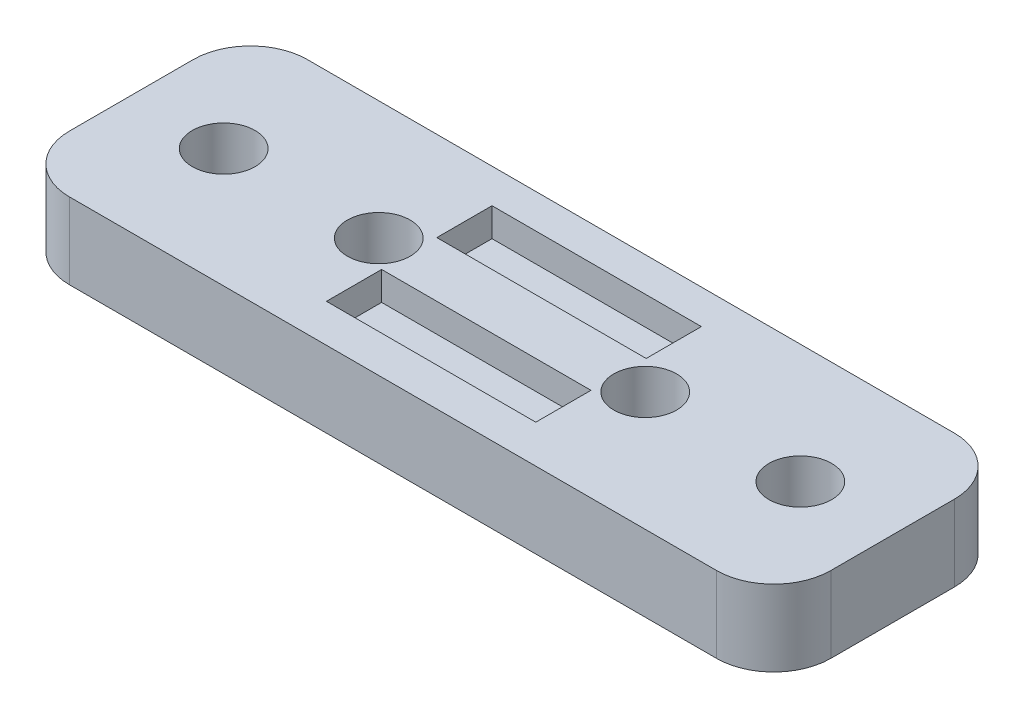
ISO-10303-21;
HEADER;
FILE_DESCRIPTION(('STEP AP214'),'2;1');
FILE_NAME('part.step','',(''),(''),'','','');
FILE_SCHEMA(('AUTOMOTIVE_DESIGN { 1 0 10303 214 1 1 1 1 }'));
ENDSEC;
DATA;
#1=APPLICATION_CONTEXT('core data for automotive mechanical design processes');
#2=APPLICATION_PROTOCOL_DEFINITION('international standard','automotive_design',2000,#1);
#3=PRODUCT_CONTEXT('',#1,'mechanical');
#4=PRODUCT('Part','Part','',(#3));
#5=PRODUCT_RELATED_PRODUCT_CATEGORY('part','',(#4));
#6=PRODUCT_DEFINITION_FORMATION('','',#4);
#7=PRODUCT_DEFINITION_CONTEXT('part definition',#1,'design');
#8=PRODUCT_DEFINITION('design','',#6,#7);
#9=PRODUCT_DEFINITION_SHAPE('','',#8);
#10=(LENGTH_UNIT() NAMED_UNIT(*) SI_UNIT(.MILLI.,.METRE.));
#11=(NAMED_UNIT(*) PLANE_ANGLE_UNIT() SI_UNIT($,.RADIAN.));
#12=(NAMED_UNIT(*) SI_UNIT($,.STERADIAN.) SOLID_ANGLE_UNIT());
#13=UNCERTAINTY_MEASURE_WITH_UNIT(LENGTH_MEASURE(1.E-05),#10,'distance_accuracy_value','');
#14=(GEOMETRIC_REPRESENTATION_CONTEXT(3) GLOBAL_UNCERTAINTY_ASSIGNED_CONTEXT((#13)) GLOBAL_UNIT_ASSIGNED_CONTEXT((#10,
#11,#12)) REPRESENTATION_CONTEXT('',''));
#15=CARTESIAN_POINT('',(0.,0.,0.));
#16=DIRECTION('',(0.,0.,1.));
#17=DIRECTION('',(1.,0.,0.));
#18=AXIS2_PLACEMENT_3D('',#15,#16,#17);
#19=CARTESIAN_POINT('',(0.,4.,0.));
#20=DIRECTION('',(1.,0.,0.));
#21=DIRECTION('',(0.,0.,-1.));
#22=AXIS2_PLACEMENT_3D('',#19,#20,#21);
#23=PLANE('',#22);
#24=DIRECTION('',(0.,0.,1.));
#25=VECTOR('',#24,1.);
#26=CARTESIAN_POINT('',(0.,0.,0.));
#27=LINE('',#26,#25);
#28=CARTESIAN_POINT('',(0.,0.,3.));
#29=VERTEX_POINT('',#28);
#30=CARTESIAN_POINT('',(0.,0.,9.5));
#31=VERTEX_POINT('',#30);
#32=EDGE_CURVE('E243',#29,#31,#27,.T.);
#33=ORIENTED_EDGE('',*,*,#32,.T.);
#34=DIRECTION('',(0.,-1.,0.));
#35=VECTOR('',#34,1.);
#36=CARTESIAN_POINT('',(0.,4.,9.5));
#37=LINE('',#36,#35);
#38=CARTESIAN_POINT('',(0.,4.,9.5));
#39=VERTEX_POINT('',#38);
#40=EDGE_CURVE('E11',#31,#39,#37,.F.);
#41=ORIENTED_EDGE('',*,*,#40,.T.);
#42=DIRECTION('',(0.,0.,1.));
#43=VECTOR('',#42,1.);
#44=CARTESIAN_POINT('',(0.,4.,0.));
#45=LINE('',#44,#43);
#46=CARTESIAN_POINT('',(0.,4.,3.));
#47=VERTEX_POINT('',#46);
#48=EDGE_CURVE('E246',#47,#39,#45,.T.);
#49=ORIENTED_EDGE('',*,*,#48,.F.);
#50=DIRECTION('',(0.,-1.,0.));
#51=VECTOR('',#50,1.);
#52=CARTESIAN_POINT('',(0.,4.,3.));
#53=LINE('',#52,#51);
#54=EDGE_CURVE('E41',#47,#29,#53,.T.);
#55=ORIENTED_EDGE('',*,*,#54,.T.);
#56=EDGE_LOOP('',(#33,#41,#49,#55));
#57=FACE_BOUND('',#56,.T.);
#58=ADVANCED_FACE('F33',(#57),#23,.F.);
#59=CARTESIAN_POINT('',(0.,4.,12.5));
#60=DIRECTION('',(0.,0.,-1.));
#61=DIRECTION('',(-1.,0.,0.));
#62=AXIS2_PLACEMENT_3D('',#59,#60,#61);
#63=PLANE('',#62);
#64=DIRECTION('',(1.,0.,0.));
#65=VECTOR('',#64,1.);
#66=CARTESIAN_POINT('',(0.,0.,12.5));
#67=LINE('',#66,#65);
#68=CARTESIAN_POINT('',(3.00000000000001,0.,12.5));
#69=VERTEX_POINT('',#68);
#70=CARTESIAN_POINT('',(37.,0.,12.5));
#71=VERTEX_POINT('',#70);
#72=EDGE_CURVE('E260',#69,#71,#67,.T.);
#73=ORIENTED_EDGE('',*,*,#72,.T.);
#74=DIRECTION('',(0.,-1.,0.));
#75=VECTOR('',#74,1.);
#76=CARTESIAN_POINT('',(37.,4.,12.5));
#77=LINE('',#76,#75);
#78=CARTESIAN_POINT('',(37.,4.,12.5));
#79=VERTEX_POINT('',#78);
#80=EDGE_CURVE('E48',#71,#79,#77,.F.);
#81=ORIENTED_EDGE('',*,*,#80,.T.);
#82=DIRECTION('',(1.,0.,0.));
#83=VECTOR('',#82,1.);
#84=CARTESIAN_POINT('',(0.,4.,12.5));
#85=LINE('',#84,#83);
#86=CARTESIAN_POINT('',(3.00000000000001,4.,12.5));
#87=VERTEX_POINT('',#86);
#88=EDGE_CURVE('E248',#87,#79,#85,.T.);
#89=ORIENTED_EDGE('',*,*,#88,.F.);
#90=DIRECTION('',(0.,-1.,0.));
#91=VECTOR('',#90,1.);
#92=CARTESIAN_POINT('',(3.00000000000001,4.,12.5));
#93=LINE('',#92,#91);
#94=EDGE_CURVE('E291',#87,#69,#93,.T.);
#95=ORIENTED_EDGE('',*,*,#94,.T.);
#96=EDGE_LOOP('',(#73,#81,#89,#95));
#97=FACE_BOUND('',#96,.T.);
#98=ADVANCED_FACE('F309',(#97),#63,.F.);
#99=CARTESIAN_POINT('',(40.,4.,0.));
#100=DIRECTION('',(-1.,0.,0.));
#101=DIRECTION('',(0.,0.,1.));
#102=AXIS2_PLACEMENT_3D('',#99,#100,#101);
#103=PLANE('',#102);
#104=DIRECTION('',(0.,0.,-1.));
#105=VECTOR('',#104,1.);
#106=CARTESIAN_POINT('',(40.,0.,0.));
#107=LINE('',#106,#105);
#108=CARTESIAN_POINT('',(40.,0.,9.5));
#109=VERTEX_POINT('',#108);
#110=CARTESIAN_POINT('',(40.,0.,3.));
#111=VERTEX_POINT('',#110);
#112=EDGE_CURVE('E262',#109,#111,#107,.T.);
#113=ORIENTED_EDGE('',*,*,#112,.T.);
#114=DIRECTION('',(0.,-1.,0.));
#115=VECTOR('',#114,1.);
#116=CARTESIAN_POINT('',(40.,4.,3.));
#117=LINE('',#116,#115);
#118=CARTESIAN_POINT('',(40.,4.,3.));
#119=VERTEX_POINT('',#118);
#120=EDGE_CURVE('E282',#111,#119,#117,.F.);
#121=ORIENTED_EDGE('',*,*,#120,.T.);
#122=DIRECTION('',(0.,0.,-1.));
#123=VECTOR('',#122,1.);
#124=CARTESIAN_POINT('',(40.,4.,0.));
#125=LINE('',#124,#123);
#126=CARTESIAN_POINT('',(40.,4.,9.5));
#127=VERTEX_POINT('',#126);
#128=EDGE_CURVE('E251',#127,#119,#125,.T.);
#129=ORIENTED_EDGE('',*,*,#128,.F.);
#130=DIRECTION('',(0.,-1.,0.));
#131=VECTOR('',#130,1.);
#132=CARTESIAN_POINT('',(40.,4.,9.5));
#133=LINE('',#132,#131);
#134=EDGE_CURVE('E279',#127,#109,#133,.T.);
#135=ORIENTED_EDGE('',*,*,#134,.T.);
#136=EDGE_LOOP('',(#113,#121,#129,#135));
#137=FACE_BOUND('',#136,.T.);
#138=ADVANCED_FACE('F318',(#137),#103,.F.);
#139=CARTESIAN_POINT('',(0.,4.,0.));
#140=DIRECTION('',(0.,0.,1.));
#141=DIRECTION('',(1.,0.,0.));
#142=AXIS2_PLACEMENT_3D('',#139,#140,#141);
#143=PLANE('',#142);
#144=DIRECTION('',(-1.,0.,0.));
#145=VECTOR('',#144,1.);
#146=CARTESIAN_POINT('',(0.,4.,0.));
#147=LINE('',#146,#145);
#148=CARTESIAN_POINT('',(37.,4.,0.));
#149=VERTEX_POINT('',#148);
#150=CARTESIAN_POINT('',(3.,4.,0.));
#151=VERTEX_POINT('',#150);
#152=EDGE_CURVE('E254',#149,#151,#147,.T.);
#153=ORIENTED_EDGE('',*,*,#152,.F.);
#154=DIRECTION('',(0.,-1.,0.));
#155=VECTOR('',#154,1.);
#156=CARTESIAN_POINT('',(37.,4.,0.));
#157=LINE('',#156,#155);
#158=CARTESIAN_POINT('',(37.,0.,0.));
#159=VERTEX_POINT('',#158);
#160=EDGE_CURVE('E268',#149,#159,#157,.T.);
#161=ORIENTED_EDGE('',*,*,#160,.T.);
#162=DIRECTION('',(-1.,0.,0.));
#163=VECTOR('',#162,1.);
#164=CARTESIAN_POINT('',(0.,0.,0.));
#165=LINE('',#164,#163);
#166=CARTESIAN_POINT('',(3.,0.,0.));
#167=VERTEX_POINT('',#166);
#168=EDGE_CURVE('E249',#159,#167,#165,.T.);
#169=ORIENTED_EDGE('',*,*,#168,.T.);
#170=DIRECTION('',(0.,-1.,0.));
#171=VECTOR('',#170,1.);
#172=CARTESIAN_POINT('',(3.,4.,0.));
#173=LINE('',#172,#171);
#174=EDGE_CURVE('E257',#167,#151,#173,.F.);
#175=ORIENTED_EDGE('',*,*,#174,.T.);
#176=EDGE_LOOP('',(#153,#161,#169,#175));
#177=FACE_BOUND('',#176,.T.);
#178=ADVANCED_FACE('F326',(#177),#143,.F.);
#179=CARTESIAN_POINT('',(0.,4.,0.));
#180=DIRECTION('',(0.,1.,0.));
#181=DIRECTION('',(0.,0.,1.));
#182=AXIS2_PLACEMENT_3D('',#179,#180,#181);
#183=PLANE('',#182);
#184=DIRECTION('',(-1.,0.,0.));
#185=VECTOR('',#184,1.);
#186=CARTESIAN_POINT('',(14.5000000000004,4.,7.6));
#187=LINE('',#186,#185);
#188=CARTESIAN_POINT('',(25.5000000000004,4.,7.6));
#189=VERTEX_POINT('',#188);
#190=CARTESIAN_POINT('',(14.5000000000004,4.,7.6));
#191=VERTEX_POINT('',#190);
#192=EDGE_CURVE('E154',#189,#191,#187,.T.);
#193=ORIENTED_EDGE('',*,*,#192,.F.);
#194=DIRECTION('',(0.,0.,-1.));
#195=VECTOR('',#194,1.);
#196=CARTESIAN_POINT('',(25.5000000000004,4.,7.6));
#197=LINE('',#196,#195);
#198=CARTESIAN_POINT('',(25.5000000000004,4.,10.5));
#199=VERTEX_POINT('',#198);
#200=EDGE_CURVE('E171',#199,#189,#197,.T.);
#201=ORIENTED_EDGE('',*,*,#200,.F.);
#202=DIRECTION('',(1.,0.,0.));
#203=VECTOR('',#202,1.);
#204=CARTESIAN_POINT('',(14.5000000000004,4.,10.5));
#205=LINE('',#204,#203);
#206=CARTESIAN_POINT('',(14.5000000000004,4.,10.5));
#207=VERTEX_POINT('',#206);
#208=EDGE_CURVE('E174',#207,#199,#205,.T.);
#209=ORIENTED_EDGE('',*,*,#208,.F.);
#210=DIRECTION('',(0.,0.,1.));
#211=VECTOR('',#210,1.);
#212=CARTESIAN_POINT('',(14.5000000000004,4.,7.6));
#213=LINE('',#212,#211);
#214=EDGE_CURVE('E180',#191,#207,#213,.T.);
#215=ORIENTED_EDGE('',*,*,#214,.F.);
#216=EDGE_LOOP('',(#193,#201,#209,#215));
#217=FACE_BOUND('',#216,.T.);
#218=DIRECTION('',(0.,0.,1.));
#219=VECTOR('',#218,1.);
#220=CARTESIAN_POINT('',(14.5,4.,1.8));
#221=LINE('',#220,#219);
#222=CARTESIAN_POINT('',(14.5,4.,1.8));
#223=VERTEX_POINT('',#222);
#224=CARTESIAN_POINT('',(14.5,4.,4.7));
#225=VERTEX_POINT('',#224);
#226=EDGE_CURVE('E186',#223,#225,#221,.T.);
#227=ORIENTED_EDGE('',*,*,#226,.F.);
#228=DIRECTION('',(-1.,0.,0.));
#229=VECTOR('',#228,1.);
#230=CARTESIAN_POINT('',(14.5,4.,1.8));
#231=LINE('',#230,#229);
#232=CARTESIAN_POINT('',(25.5,4.,1.8));
#233=VERTEX_POINT('',#232);
#234=EDGE_CURVE('E194',#233,#223,#231,.T.);
#235=ORIENTED_EDGE('',*,*,#234,.F.);
#236=DIRECTION('',(0.,0.,-1.));
#237=VECTOR('',#236,1.);
#238=CARTESIAN_POINT('',(25.5,4.,1.8));
#239=LINE('',#238,#237);
#240=CARTESIAN_POINT('',(25.5,4.,4.7));
#241=VERTEX_POINT('',#240);
#242=EDGE_CURVE('E208',#241,#233,#239,.T.);
#243=ORIENTED_EDGE('',*,*,#242,.F.);
#244=DIRECTION('',(1.,0.,0.));
#245=VECTOR('',#244,1.);
#246=CARTESIAN_POINT('',(14.5,4.,4.7));
#247=LINE('',#246,#245);
#248=EDGE_CURVE('E205',#225,#241,#247,.T.);
#249=ORIENTED_EDGE('',*,*,#248,.F.);
#250=EDGE_LOOP('',(#227,#235,#243,#249));
#251=FACE_BOUND('',#250,.T.);
#252=CARTESIAN_POINT('',(13.,4.,6.25));
#253=DIRECTION('',(0.,1.,0.));
#254=DIRECTION('',(0.,0.,1.));
#255=AXIS2_PLACEMENT_3D('',#252,#253,#254);
#256=CIRCLE('',#255,1.65);
#257=CARTESIAN_POINT('',(13.,4.,7.9));
#258=VERTEX_POINT('',#257);
#259=EDGE_CURVE('E226',#258,#258,#256,.T.);
#260=ORIENTED_EDGE('',*,*,#259,.F.);
#261=EDGE_LOOP('',(#260));
#262=FACE_BOUND('',#261,.T.);
#263=CARTESIAN_POINT('',(27.,4.,6.25));
#264=DIRECTION('',(0.,1.,0.));
#265=DIRECTION('',(0.,0.,1.));
#266=AXIS2_PLACEMENT_3D('',#263,#264,#265);
#267=CIRCLE('',#266,1.65);
#268=CARTESIAN_POINT('',(27.,4.,7.9));
#269=VERTEX_POINT('',#268);
#270=EDGE_CURVE('E232',#269,#269,#267,.T.);
#271=ORIENTED_EDGE('',*,*,#270,.F.);
#272=EDGE_LOOP('',(#271));
#273=FACE_BOUND('',#272,.T.);
#274=CARTESIAN_POINT('',(35.15,4.,6.25));
#275=DIRECTION('',(0.,1.,0.));
#276=DIRECTION('',(0.,0.,1.));
#277=AXIS2_PLACEMENT_3D('',#274,#275,#276);
#278=CIRCLE('',#277,1.65);
#279=CARTESIAN_POINT('',(35.15,4.,7.9));
#280=VERTEX_POINT('',#279);
#281=EDGE_CURVE('E215',#280,#280,#278,.T.);
#282=ORIENTED_EDGE('',*,*,#281,.F.);
#283=EDGE_LOOP('',(#282));
#284=FACE_BOUND('',#283,.T.);
#285=CARTESIAN_POINT('',(4.85,4.,6.25));
#286=DIRECTION('',(0.,1.,0.));
#287=DIRECTION('',(0.,0.,1.));
#288=AXIS2_PLACEMENT_3D('',#285,#286,#287);
#289=CIRCLE('',#288,1.65);
#290=CARTESIAN_POINT('',(4.85,4.,7.9));
#291=VERTEX_POINT('',#290);
#292=EDGE_CURVE('E225',#291,#291,#289,.T.);
#293=ORIENTED_EDGE('',*,*,#292,.F.);
#294=EDGE_LOOP('',(#293));
#295=FACE_BOUND('',#294,.T.);
#296=ORIENTED_EDGE('',*,*,#128,.T.);
#297=CARTESIAN_POINT('',(37.,4.,3.));
#298=DIRECTION('',(0.,1.,0.));
#299=DIRECTION('',(0.,0.,1.));
#300=AXIS2_PLACEMENT_3D('',#297,#298,#299);
#301=CIRCLE('',#300,3.);
#302=EDGE_CURVE('E289',#119,#149,#301,.T.);
#303=ORIENTED_EDGE('',*,*,#302,.T.);
#304=ORIENTED_EDGE('',*,*,#152,.T.);
#305=CARTESIAN_POINT('',(3.,4.,3.));
#306=DIRECTION('',(0.,1.,0.));
#307=DIRECTION('',(0.,0.,1.));
#308=AXIS2_PLACEMENT_3D('',#305,#306,#307);
#309=CIRCLE('',#308,3.);
#310=EDGE_CURVE('E284',#151,#47,#309,.T.);
#311=ORIENTED_EDGE('',*,*,#310,.T.);
#312=ORIENTED_EDGE('',*,*,#48,.T.);
#313=CARTESIAN_POINT('',(3.00000000000001,4.,9.5));
#314=DIRECTION('',(0.,1.,0.));
#315=DIRECTION('',(0.,0.,1.));
#316=AXIS2_PLACEMENT_3D('',#313,#314,#315);
#317=CIRCLE('',#316,3.);
#318=EDGE_CURVE('E55',#39,#87,#317,.T.);
#319=ORIENTED_EDGE('',*,*,#318,.T.);
#320=ORIENTED_EDGE('',*,*,#88,.T.);
#321=CARTESIAN_POINT('',(37.,4.,9.5));
#322=DIRECTION('',(0.,1.,0.));
#323=DIRECTION('',(0.,0.,1.));
#324=AXIS2_PLACEMENT_3D('',#321,#322,#323);
#325=CIRCLE('',#324,3.);
#326=EDGE_CURVE('E287',#79,#127,#325,.T.);
#327=ORIENTED_EDGE('',*,*,#326,.T.);
#328=EDGE_LOOP('',(#296,#303,#304,#311,#312,#319,#320,#327));
#329=FACE_BOUND('',#328,.T.);
#330=ADVANCED_FACE('F311',(#217,#251,#262,#273,#284,#295,#329),#183,.T.);
#331=CARTESIAN_POINT('',(0.,0.,0.));
#332=DIRECTION('',(0.,1.,0.));
#333=DIRECTION('',(0.,0.,1.));
#334=AXIS2_PLACEMENT_3D('',#331,#332,#333);
#335=PLANE('',#334);
#336=CARTESIAN_POINT('',(13.,0.,6.25));
#337=DIRECTION('',(0.,1.,0.));
#338=DIRECTION('',(0.,0.,1.));
#339=AXIS2_PLACEMENT_3D('',#336,#337,#338);
#340=CIRCLE('',#339,1.65);
#341=CARTESIAN_POINT('',(13.,0.,7.9));
#342=VERTEX_POINT('',#341);
#343=EDGE_CURVE('E222',#342,#342,#340,.T.);
#344=ORIENTED_EDGE('',*,*,#343,.T.);
#345=EDGE_LOOP('',(#344));
#346=FACE_BOUND('',#345,.T.);
#347=CARTESIAN_POINT('',(27.,0.,6.25));
#348=DIRECTION('',(0.,1.,0.));
#349=DIRECTION('',(0.,0.,1.));
#350=AXIS2_PLACEMENT_3D('',#347,#348,#349);
#351=CIRCLE('',#350,1.65);
#352=CARTESIAN_POINT('',(27.,0.,7.9));
#353=VERTEX_POINT('',#352);
#354=EDGE_CURVE('E229',#353,#353,#351,.T.);
#355=ORIENTED_EDGE('',*,*,#354,.T.);
#356=EDGE_LOOP('',(#355));
#357=FACE_BOUND('',#356,.T.);
#358=CARTESIAN_POINT('',(35.15,0.,6.25));
#359=DIRECTION('',(0.,1.,0.));
#360=DIRECTION('',(0.,0.,1.));
#361=AXIS2_PLACEMENT_3D('',#358,#359,#360);
#362=CIRCLE('',#361,1.65);
#363=CARTESIAN_POINT('',(35.15,0.,7.9));
#364=VERTEX_POINT('',#363);
#365=EDGE_CURVE('E235',#364,#364,#362,.T.);
#366=ORIENTED_EDGE('',*,*,#365,.T.);
#367=EDGE_LOOP('',(#366));
#368=FACE_BOUND('',#367,.T.);
#369=CARTESIAN_POINT('',(4.85,0.,6.25));
#370=DIRECTION('',(0.,1.,0.));
#371=DIRECTION('',(0.,0.,1.));
#372=AXIS2_PLACEMENT_3D('',#369,#370,#371);
#373=CIRCLE('',#372,1.65);
#374=CARTESIAN_POINT('',(4.85,0.,7.9));
#375=VERTEX_POINT('',#374);
#376=EDGE_CURVE('E240',#375,#375,#373,.T.);
#377=ORIENTED_EDGE('',*,*,#376,.T.);
#378=EDGE_LOOP('',(#377));
#379=FACE_BOUND('',#378,.T.);
#380=ORIENTED_EDGE('',*,*,#168,.F.);
#381=CARTESIAN_POINT('',(37.,0.,3.));
#382=DIRECTION('',(0.,1.,0.));
#383=DIRECTION('',(0.,0.,1.));
#384=AXIS2_PLACEMENT_3D('',#381,#382,#383);
#385=CIRCLE('',#384,3.);
#386=EDGE_CURVE('E277',#159,#111,#385,.F.);
#387=ORIENTED_EDGE('',*,*,#386,.T.);
#388=ORIENTED_EDGE('',*,*,#112,.F.);
#389=CARTESIAN_POINT('',(37.,0.,9.5));
#390=DIRECTION('',(0.,1.,0.));
#391=DIRECTION('',(0.,0.,1.));
#392=AXIS2_PLACEMENT_3D('',#389,#390,#391);
#393=CIRCLE('',#392,3.);
#394=EDGE_CURVE('E275',#109,#71,#393,.F.);
#395=ORIENTED_EDGE('',*,*,#394,.T.);
#396=ORIENTED_EDGE('',*,*,#72,.F.);
#397=CARTESIAN_POINT('',(3.00000000000001,0.,9.5));
#398=DIRECTION('',(0.,1.,0.));
#399=DIRECTION('',(0.,0.,1.));
#400=AXIS2_PLACEMENT_3D('',#397,#398,#399);
#401=CIRCLE('',#400,3.);
#402=EDGE_CURVE('E273',#69,#31,#401,.F.);
#403=ORIENTED_EDGE('',*,*,#402,.T.);
#404=ORIENTED_EDGE('',*,*,#32,.F.);
#405=CARTESIAN_POINT('',(3.,0.,3.));
#406=DIRECTION('',(0.,1.,0.));
#407=DIRECTION('',(0.,0.,1.));
#408=AXIS2_PLACEMENT_3D('',#405,#406,#407);
#409=CIRCLE('',#408,3.);
#410=EDGE_CURVE('E271',#29,#167,#409,.F.);
#411=ORIENTED_EDGE('',*,*,#410,.T.);
#412=EDGE_LOOP('',(#380,#387,#388,#395,#396,#403,#404,#411));
#413=FACE_BOUND('',#412,.T.);
#414=ADVANCED_FACE('F304',(#346,#357,#368,#379,#413),#335,.F.);
#415=CARTESIAN_POINT('',(4.85,0.,6.25));
#416=DIRECTION('',(0.,1.,0.));
#417=DIRECTION('',(0.,0.,1.));
#418=AXIS2_PLACEMENT_3D('',#415,#416,#417);
#419=CYLINDRICAL_SURFACE('',#418,1.65);
#420=ORIENTED_EDGE('',*,*,#376,.F.);
#421=EDGE_LOOP('',(#420));
#422=FACE_BOUND('',#421,.T.);
#423=ORIENTED_EDGE('',*,*,#292,.T.);
#424=EDGE_LOOP('',(#423));
#425=FACE_BOUND('',#424,.T.);
#426=ADVANCED_FACE('F475',(#422,#425),#419,.F.);
#427=CARTESIAN_POINT('',(35.15,0.,6.25));
#428=DIRECTION('',(0.,1.,0.));
#429=DIRECTION('',(0.,0.,1.));
#430=AXIS2_PLACEMENT_3D('',#427,#428,#429);
#431=CYLINDRICAL_SURFACE('',#430,1.65);
#432=ORIENTED_EDGE('',*,*,#365,.F.);
#433=EDGE_LOOP('',(#432));
#434=FACE_BOUND('',#433,.T.);
#435=ORIENTED_EDGE('',*,*,#281,.T.);
#436=EDGE_LOOP('',(#435));
#437=FACE_BOUND('',#436,.T.);
#438=ADVANCED_FACE('F466',(#434,#437),#431,.F.);
#439=CARTESIAN_POINT('',(27.,0.,6.25));
#440=DIRECTION('',(0.,1.,0.));
#441=DIRECTION('',(0.,0.,1.));
#442=AXIS2_PLACEMENT_3D('',#439,#440,#441);
#443=CYLINDRICAL_SURFACE('',#442,1.65);
#444=ORIENTED_EDGE('',*,*,#354,.F.);
#445=EDGE_LOOP('',(#444));
#446=FACE_BOUND('',#445,.T.);
#447=ORIENTED_EDGE('',*,*,#270,.T.);
#448=EDGE_LOOP('',(#447));
#449=FACE_BOUND('',#448,.T.);
#450=ADVANCED_FACE('F457',(#446,#449),#443,.F.);
#451=CARTESIAN_POINT('',(13.,0.,6.25));
#452=DIRECTION('',(0.,1.,0.));
#453=DIRECTION('',(0.,0.,1.));
#454=AXIS2_PLACEMENT_3D('',#451,#452,#453);
#455=CYLINDRICAL_SURFACE('',#454,1.65);
#456=ORIENTED_EDGE('',*,*,#343,.F.);
#457=EDGE_LOOP('',(#456));
#458=FACE_BOUND('',#457,.T.);
#459=ORIENTED_EDGE('',*,*,#259,.T.);
#460=EDGE_LOOP('',(#459));
#461=FACE_BOUND('',#460,.T.);
#462=ADVANCED_FACE('F448',(#458,#461),#455,.F.);
#463=CARTESIAN_POINT('',(14.5,2.5,1.8));
#464=DIRECTION('',(-1.,0.,0.));
#465=DIRECTION('',(0.,0.,1.));
#466=AXIS2_PLACEMENT_3D('',#463,#464,#465);
#467=PLANE('',#466);
#468=ORIENTED_EDGE('',*,*,#226,.T.);
#469=DIRECTION('',(0.,1.,0.));
#470=VECTOR('',#469,1.);
#471=CARTESIAN_POINT('',(14.5,2.5,4.7));
#472=LINE('',#471,#470);
#473=CARTESIAN_POINT('',(14.5,2.5,4.7));
#474=VERTEX_POINT('',#473);
#475=EDGE_CURVE('E203',#474,#225,#472,.T.);
#476=ORIENTED_EDGE('',*,*,#475,.F.);
#477=DIRECTION('',(0.,0.,1.));
#478=VECTOR('',#477,1.);
#479=CARTESIAN_POINT('',(14.5,2.5,1.8));
#480=LINE('',#479,#478);
#481=CARTESIAN_POINT('',(14.5,2.5,1.8));
#482=VERTEX_POINT('',#481);
#483=EDGE_CURVE('E190',#482,#474,#480,.T.);
#484=ORIENTED_EDGE('',*,*,#483,.F.);
#485=DIRECTION('',(0.,1.,0.));
#486=VECTOR('',#485,1.);
#487=CARTESIAN_POINT('',(14.5,2.5,1.8));
#488=LINE('',#487,#486);
#489=EDGE_CURVE('E213',#482,#223,#488,.T.);
#490=ORIENTED_EDGE('',*,*,#489,.T.);
#491=EDGE_LOOP('',(#468,#476,#484,#490));
#492=FACE_BOUND('',#491,.T.);
#493=ADVANCED_FACE('F439',(#492),#467,.F.);
#494=CARTESIAN_POINT('',(14.5,2.5,1.8));
#495=DIRECTION('',(0.,0.,-1.));
#496=DIRECTION('',(-1.,0.,0.));
#497=AXIS2_PLACEMENT_3D('',#494,#495,#496);
#498=PLANE('',#497);
#499=ORIENTED_EDGE('',*,*,#234,.T.);
#500=ORIENTED_EDGE('',*,*,#489,.F.);
#501=DIRECTION('',(-1.,0.,0.));
#502=VECTOR('',#501,1.);
#503=CARTESIAN_POINT('',(14.5,2.5,1.8));
#504=LINE('',#503,#502);
#505=CARTESIAN_POINT('',(25.5,2.5,1.8));
#506=VERTEX_POINT('',#505);
#507=EDGE_CURVE('E200',#506,#482,#504,.T.);
#508=ORIENTED_EDGE('',*,*,#507,.F.);
#509=DIRECTION('',(0.,1.,0.));
#510=VECTOR('',#509,1.);
#511=CARTESIAN_POINT('',(25.5,2.5,1.8));
#512=LINE('',#511,#510);
#513=EDGE_CURVE('E216',#506,#233,#512,.T.);
#514=ORIENTED_EDGE('',*,*,#513,.T.);
#515=EDGE_LOOP('',(#499,#500,#508,#514));
#516=FACE_BOUND('',#515,.T.);
#517=ADVANCED_FACE('F430',(#516),#498,.F.);
#518=CARTESIAN_POINT('',(25.5,2.5,1.8));
#519=DIRECTION('',(1.,0.,0.));
#520=DIRECTION('',(0.,0.,-1.));
#521=AXIS2_PLACEMENT_3D('',#518,#519,#520);
#522=PLANE('',#521);
#523=ORIENTED_EDGE('',*,*,#242,.T.);
#524=ORIENTED_EDGE('',*,*,#513,.F.);
#525=DIRECTION('',(0.,0.,-1.));
#526=VECTOR('',#525,1.);
#527=CARTESIAN_POINT('',(25.5,2.5,1.8));
#528=LINE('',#527,#526);
#529=CARTESIAN_POINT('',(25.5,2.5,4.7));
#530=VERTEX_POINT('',#529);
#531=EDGE_CURVE('E197',#530,#506,#528,.T.);
#532=ORIENTED_EDGE('',*,*,#531,.F.);
#533=DIRECTION('',(0.,1.,0.));
#534=VECTOR('',#533,1.);
#535=CARTESIAN_POINT('',(25.5,2.5,4.7));
#536=LINE('',#535,#534);
#537=EDGE_CURVE('E218',#530,#241,#536,.T.);
#538=ORIENTED_EDGE('',*,*,#537,.T.);
#539=EDGE_LOOP('',(#523,#524,#532,#538));
#540=FACE_BOUND('',#539,.T.);
#541=ADVANCED_FACE('F421',(#540),#522,.F.);
#542=CARTESIAN_POINT('',(14.5,2.5,4.7));
#543=DIRECTION('',(0.,0.,1.));
#544=DIRECTION('',(1.,0.,0.));
#545=AXIS2_PLACEMENT_3D('',#542,#543,#544);
#546=PLANE('',#545);
#547=ORIENTED_EDGE('',*,*,#248,.T.);
#548=ORIENTED_EDGE('',*,*,#537,.F.);
#549=DIRECTION('',(1.,0.,0.));
#550=VECTOR('',#549,1.);
#551=CARTESIAN_POINT('',(14.5,2.5,4.7));
#552=LINE('',#551,#550);
#553=EDGE_CURVE('E193',#474,#530,#552,.T.);
#554=ORIENTED_EDGE('',*,*,#553,.F.);
#555=ORIENTED_EDGE('',*,*,#475,.T.);
#556=EDGE_LOOP('',(#547,#548,#554,#555));
#557=FACE_BOUND('',#556,.T.);
#558=ADVANCED_FACE('F412',(#557),#546,.F.);
#559=CARTESIAN_POINT('',(0.,2.5,0.));
#560=DIRECTION('',(0.,1.,0.));
#561=DIRECTION('',(0.,0.,1.));
#562=AXIS2_PLACEMENT_3D('',#559,#560,#561);
#563=PLANE('',#562);
#564=ORIENTED_EDGE('',*,*,#483,.T.);
#565=ORIENTED_EDGE('',*,*,#553,.T.);
#566=ORIENTED_EDGE('',*,*,#531,.T.);
#567=ORIENTED_EDGE('',*,*,#507,.T.);
#568=EDGE_LOOP('',(#564,#565,#566,#567));
#569=FACE_BOUND('',#568,.T.);
#570=ADVANCED_FACE('F404',(#569),#563,.T.);
#571=CARTESIAN_POINT('',(14.5000000000004,2.5,7.6));
#572=DIRECTION('',(0.,0.,-1.));
#573=DIRECTION('',(-1.,0.,0.));
#574=AXIS2_PLACEMENT_3D('',#571,#572,#573);
#575=PLANE('',#574);
#576=ORIENTED_EDGE('',*,*,#192,.T.);
#577=DIRECTION('',(0.,1.,0.));
#578=VECTOR('',#577,1.);
#579=CARTESIAN_POINT('',(14.5000000000004,2.5,7.6));
#580=LINE('',#579,#578);
#581=CARTESIAN_POINT('',(14.5000000000004,2.5,7.6));
#582=VERTEX_POINT('',#581);
#583=EDGE_CURVE('E147',#582,#191,#580,.T.);
#584=ORIENTED_EDGE('',*,*,#583,.F.);
#585=DIRECTION('',(-1.,0.,0.));
#586=VECTOR('',#585,1.);
#587=CARTESIAN_POINT('',(14.5000000000004,2.5,7.6));
#588=LINE('',#587,#586);
#589=CARTESIAN_POINT('',(25.5000000000004,2.5,7.6));
#590=VERTEX_POINT('',#589);
#591=EDGE_CURVE('E151',#590,#582,#588,.T.);
#592=ORIENTED_EDGE('',*,*,#591,.F.);
#593=DIRECTION('',(0.,1.,0.));
#594=VECTOR('',#593,1.);
#595=CARTESIAN_POINT('',(25.5000000000004,2.5,7.6));
#596=LINE('',#595,#594);
#597=EDGE_CURVE('E184',#590,#189,#596,.T.);
#598=ORIENTED_EDGE('',*,*,#597,.T.);
#599=EDGE_LOOP('',(#576,#584,#592,#598));
#600=FACE_BOUND('',#599,.T.);
#601=ADVANCED_FACE('F149',(#600),#575,.F.);
#602=CARTESIAN_POINT('',(25.5000000000004,2.5,7.6));
#603=DIRECTION('',(1.,0.,0.));
#604=DIRECTION('',(0.,0.,-1.));
#605=AXIS2_PLACEMENT_3D('',#602,#603,#604);
#606=PLANE('',#605);
#607=ORIENTED_EDGE('',*,*,#200,.T.);
#608=ORIENTED_EDGE('',*,*,#597,.F.);
#609=DIRECTION('',(0.,0.,-1.));
#610=VECTOR('',#609,1.);
#611=CARTESIAN_POINT('',(25.5000000000004,2.5,7.6));
#612=LINE('',#611,#610);
#613=CARTESIAN_POINT('',(25.5000000000004,2.5,10.5));
#614=VERTEX_POINT('',#613);
#615=EDGE_CURVE('E159',#614,#590,#612,.T.);
#616=ORIENTED_EDGE('',*,*,#615,.F.);
#617=DIRECTION('',(0.,1.,0.));
#618=VECTOR('',#617,1.);
#619=CARTESIAN_POINT('',(25.5000000000004,2.5,10.5));
#620=LINE('',#619,#618);
#621=EDGE_CURVE('E187',#614,#199,#620,.T.);
#622=ORIENTED_EDGE('',*,*,#621,.T.);
#623=EDGE_LOOP('',(#607,#608,#616,#622));
#624=FACE_BOUND('',#623,.T.);
#625=ADVANCED_FACE('F387',(#624),#606,.F.);
#626=CARTESIAN_POINT('',(14.5000000000004,2.5,10.5));
#627=DIRECTION('',(0.,0.,1.));
#628=DIRECTION('',(1.,0.,0.));
#629=AXIS2_PLACEMENT_3D('',#626,#627,#628);
#630=PLANE('',#629);
#631=ORIENTED_EDGE('',*,*,#208,.T.);
#632=ORIENTED_EDGE('',*,*,#621,.F.);
#633=DIRECTION('',(1.,0.,0.));
#634=VECTOR('',#633,1.);
#635=CARTESIAN_POINT('',(14.5000000000004,2.5,10.5));
#636=LINE('',#635,#634);
#637=CARTESIAN_POINT('',(14.5000000000004,2.5,10.5));
#638=VERTEX_POINT('',#637);
#639=EDGE_CURVE('E167',#638,#614,#636,.T.);
#640=ORIENTED_EDGE('',*,*,#639,.F.);
#641=DIRECTION('',(0.,1.,0.));
#642=VECTOR('',#641,1.);
#643=CARTESIAN_POINT('',(14.5000000000004,2.5,10.5));
#644=LINE('',#643,#642);
#645=EDGE_CURVE('E158',#638,#207,#644,.T.);
#646=ORIENTED_EDGE('',*,*,#645,.T.);
#647=EDGE_LOOP('',(#631,#632,#640,#646));
#648=FACE_BOUND('',#647,.T.);
#649=ADVANCED_FACE('F379',(#648),#630,.F.);
#650=CARTESIAN_POINT('',(14.5000000000004,2.5,7.6));
#651=DIRECTION('',(-1.,0.,0.));
#652=DIRECTION('',(0.,0.,1.));
#653=AXIS2_PLACEMENT_3D('',#650,#651,#652);
#654=PLANE('',#653);
#655=ORIENTED_EDGE('',*,*,#214,.T.);
#656=ORIENTED_EDGE('',*,*,#645,.F.);
#657=DIRECTION('',(0.,0.,1.));
#658=VECTOR('',#657,1.);
#659=CARTESIAN_POINT('',(14.5000000000004,2.5,7.6));
#660=LINE('',#659,#658);
#661=EDGE_CURVE('E162',#582,#638,#660,.T.);
#662=ORIENTED_EDGE('',*,*,#661,.F.);
#663=ORIENTED_EDGE('',*,*,#583,.T.);
#664=EDGE_LOOP('',(#655,#656,#662,#663));
#665=FACE_BOUND('',#664,.T.);
#666=ADVANCED_FACE('F163',(#665),#654,.F.);
#667=CARTESIAN_POINT('',(0.,2.5,0.));
#668=DIRECTION('',(0.,-1.,0.));
#669=DIRECTION('',(0.,0.,-1.));
#670=AXIS2_PLACEMENT_3D('',#667,#668,#669);
#671=PLANE('',#670);
#672=ORIENTED_EDGE('',*,*,#591,.T.);
#673=ORIENTED_EDGE('',*,*,#661,.T.);
#674=ORIENTED_EDGE('',*,*,#639,.T.);
#675=ORIENTED_EDGE('',*,*,#615,.T.);
#676=EDGE_LOOP('',(#672,#673,#674,#675));
#677=FACE_BOUND('',#676,.T.);
#678=ADVANCED_FACE('F169',(#677),#671,.F.);
#679=CARTESIAN_POINT('',(37.,4.,3.));
#680=DIRECTION('',(0.,-1.,0.));
#681=DIRECTION('',(0.,0.,-1.));
#682=AXIS2_PLACEMENT_3D('',#679,#680,#681);
#683=CYLINDRICAL_SURFACE('',#682,3.);
#684=ORIENTED_EDGE('',*,*,#302,.F.);
#685=ORIENTED_EDGE('',*,*,#120,.F.);
#686=ORIENTED_EDGE('',*,*,#386,.F.);
#687=ORIENTED_EDGE('',*,*,#160,.F.);
#688=EDGE_LOOP('',(#684,#685,#686,#687));
#689=FACE_BOUND('',#688,.T.);
#690=ADVANCED_FACE('F323',(#689),#683,.T.);
#691=CARTESIAN_POINT('',(37.,4.,9.5));
#692=DIRECTION('',(0.,-1.,0.));
#693=DIRECTION('',(0.,0.,-1.));
#694=AXIS2_PLACEMENT_3D('',#691,#692,#693);
#695=CYLINDRICAL_SURFACE('',#694,3.);
#696=ORIENTED_EDGE('',*,*,#326,.F.);
#697=ORIENTED_EDGE('',*,*,#80,.F.);
#698=ORIENTED_EDGE('',*,*,#394,.F.);
#699=ORIENTED_EDGE('',*,*,#134,.F.);
#700=EDGE_LOOP('',(#696,#697,#698,#699));
#701=FACE_BOUND('',#700,.T.);
#702=ADVANCED_FACE('F315',(#701),#695,.T.);
#703=CARTESIAN_POINT('',(3.00000000000001,4.,9.5));
#704=DIRECTION('',(0.,-1.,0.));
#705=DIRECTION('',(0.,0.,-1.));
#706=AXIS2_PLACEMENT_3D('',#703,#704,#705);
#707=CYLINDRICAL_SURFACE('',#706,3.);
#708=ORIENTED_EDGE('',*,*,#318,.F.);
#709=ORIENTED_EDGE('',*,*,#40,.F.);
#710=ORIENTED_EDGE('',*,*,#402,.F.);
#711=ORIENTED_EDGE('',*,*,#94,.F.);
#712=EDGE_LOOP('',(#708,#709,#710,#711));
#713=FACE_BOUND('',#712,.T.);
#714=ADVANCED_FACE('F308',(#713),#707,.T.);
#715=CARTESIAN_POINT('',(3.,4.,3.));
#716=DIRECTION('',(0.,-1.,0.));
#717=DIRECTION('',(0.,0.,-1.));
#718=AXIS2_PLACEMENT_3D('',#715,#716,#717);
#719=CYLINDRICAL_SURFACE('',#718,3.);
#720=ORIENTED_EDGE('',*,*,#310,.F.);
#721=ORIENTED_EDGE('',*,*,#174,.F.);
#722=ORIENTED_EDGE('',*,*,#410,.F.);
#723=ORIENTED_EDGE('',*,*,#54,.F.);
#724=EDGE_LOOP('',(#720,#721,#722,#723));
#725=FACE_BOUND('',#724,.T.);
#726=ADVANCED_FACE('F35',(#725),#719,.T.);
#727=CLOSED_SHELL('',(#58,#98,#138,#178,#330,#414,#426,#438,#450,#462,#493,#517,#541,#558,#570,
#601,#625,#649,#666,#678,#690,#702,#714,#726));
#728=MANIFOLD_SOLID_BREP('B2',#727);
#729=ADVANCED_BREP_SHAPE_REPRESENTATION('',(#18,#728),#14);
#730=SHAPE_DEFINITION_REPRESENTATION(#9,#729);
ENDSEC;
END-ISO-10303-21;
